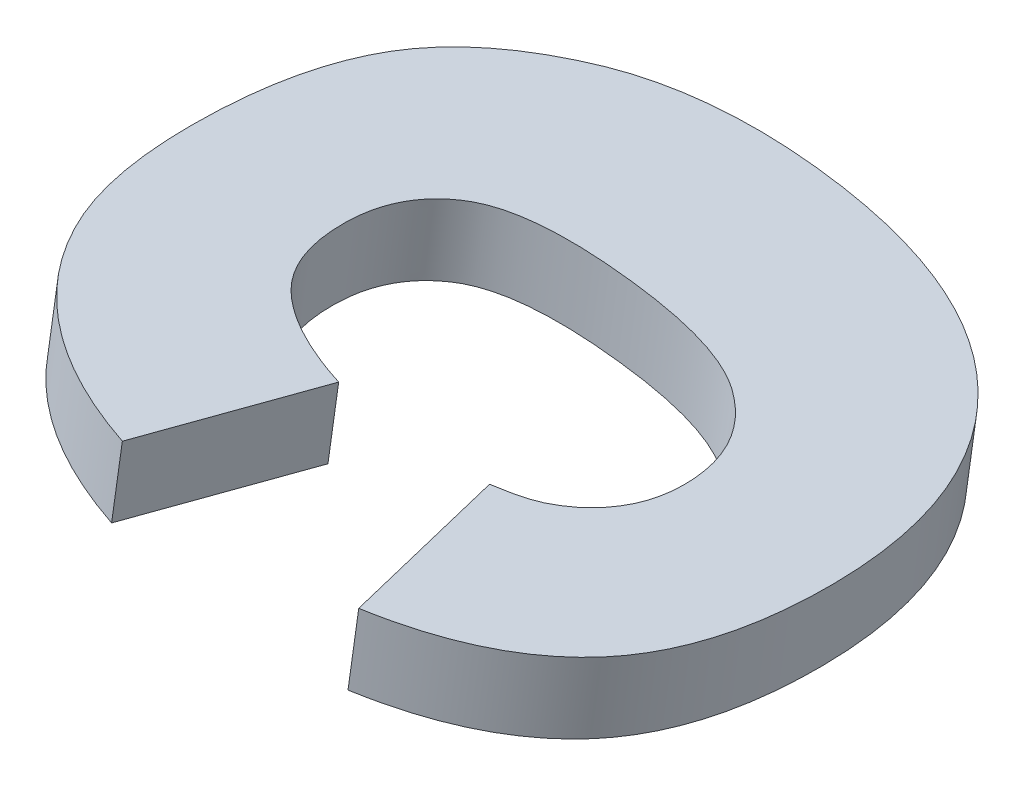
ISO-10303-21;
HEADER;
FILE_DESCRIPTION(('STEP AP214'),'2;1');
FILE_NAME('part.step','',(''),(''),'','','');
FILE_SCHEMA(('AUTOMOTIVE_DESIGN { 1 0 10303 214 1 1 1 1 }'));
ENDSEC;
DATA;
#1=APPLICATION_CONTEXT('core data for automotive mechanical design processes');
#2=APPLICATION_PROTOCOL_DEFINITION('international standard','automotive_design',2000,#1);
#3=PRODUCT_CONTEXT('',#1,'mechanical');
#4=PRODUCT('Part','Part','',(#3));
#5=PRODUCT_RELATED_PRODUCT_CATEGORY('part','',(#4));
#6=PRODUCT_DEFINITION_FORMATION('','',#4);
#7=PRODUCT_DEFINITION_CONTEXT('part definition',#1,'design');
#8=PRODUCT_DEFINITION('design','',#6,#7);
#9=PRODUCT_DEFINITION_SHAPE('','',#8);
#10=(LENGTH_UNIT() NAMED_UNIT(*) SI_UNIT(.MILLI.,.METRE.));
#11=(NAMED_UNIT(*) PLANE_ANGLE_UNIT() SI_UNIT($,.RADIAN.));
#12=(NAMED_UNIT(*) SI_UNIT($,.STERADIAN.) SOLID_ANGLE_UNIT());
#13=UNCERTAINTY_MEASURE_WITH_UNIT(LENGTH_MEASURE(1.E-05),#10,'distance_accuracy_value','');
#14=(GEOMETRIC_REPRESENTATION_CONTEXT(3) GLOBAL_UNCERTAINTY_ASSIGNED_CONTEXT((#13)) GLOBAL_UNIT_ASSIGNED_CONTEXT((#10,
#11,#12)) REPRESENTATION_CONTEXT('',''));
#15=CARTESIAN_POINT('',(0.,0.,0.));
#16=DIRECTION('',(0.,0.,1.));
#17=DIRECTION('',(1.,0.,0.));
#18=AXIS2_PLACEMENT_3D('',#15,#16,#17);
#19=CARTESIAN_POINT('',(837.027965839878,618.973432289034,2834.20564320807));
#20=DIRECTION('',(0.947941965636704,-0.133001987377289,0.289338039563609));
#21=DIRECTION('',(0.286420824998837,-0.0409901500375597,-0.957226680889582));
#22=AXIS2_PLACEMENT_3D('',#19,#20,#21);
#23=PLANE('',#22);
#24=CARTESIAN_POINT('',(835.636235234056,609.070754474657,2834.21326065255));
#25=CARTESIAN_POINT('',(832.395032490339,609.534608270091,2845.04545396276));
#26=CARTESIAN_POINT('',(829.153829746621,609.998462065526,2855.87764727298));
#27=B_SPLINE_CURVE_WITH_KNOTS('',2,(#24,#25,#26),.UNSPECIFIED.,.F.,.F.,(3,3),(0.,1.),.UNSPECIFIED.);
#28=CARTESIAN_POINT('',(835.636235234056,609.070754474657,2834.21326065255));
#29=VERTEX_POINT('',#28);
#30=CARTESIAN_POINT('',(829.153829746621,609.998462065526,2855.87764727298));
#31=VERTEX_POINT('',#30);
#32=EDGE_CURVE('E91',#29,#31,#27,.T.);
#33=ORIENTED_EDGE('',*,*,#32,.F.);
#34=DIRECTION('',(-0.139173060582166,-0.990267781437723,0.000761744447259926));
#35=VECTOR('',#34,1.);
#36=CARTESIAN_POINT('',(837.027965839878,618.973432289034,2834.20564320807));
#37=LINE('',#36,#35);
#38=CARTESIAN_POINT('',(837.027965839878,618.973432289034,2834.20564320807));
#39=VERTEX_POINT('',#38);
#40=EDGE_CURVE('E33',#39,#29,#37,.T.);
#41=ORIENTED_EDGE('',*,*,#40,.F.);
#42=CARTESIAN_POINT('',(837.027965839878,618.973432289034,2834.20564320807));
#43=CARTESIAN_POINT('',(833.78676309616,619.437286084468,2845.03783651829));
#44=CARTESIAN_POINT('',(830.545560352443,619.901139879903,2855.8700298285));
#45=B_SPLINE_CURVE_WITH_KNOTS('',2,(#42,#43,#44),.UNSPECIFIED.,.F.,.F.,(3,3),(0.,1.),.UNSPECIFIED.);
#46=CARTESIAN_POINT('',(830.545560352443,619.901139879903,2855.8700298285));
#47=VERTEX_POINT('',#46);
#48=EDGE_CURVE('E72',#39,#47,#45,.T.);
#49=ORIENTED_EDGE('',*,*,#48,.T.);
#50=DIRECTION('',(-0.139173060582166,-0.990267781437723,0.000761744447259926));
#51=VECTOR('',#50,1.);
#52=CARTESIAN_POINT('',(830.545560352443,619.901139879903,2855.8700298285));
#53=LINE('',#52,#51);
#54=EDGE_CURVE('E11',#47,#31,#53,.T.);
#55=ORIENTED_EDGE('',*,*,#54,.T.);
#56=EDGE_LOOP('',(#33,#41,#49,#55));
#57=FACE_BOUND('',#56,.T.);
#58=ADVANCED_FACE('F17',(#57),#23,.T.);
#59=CARTESIAN_POINT('',(830.545560352443,619.901139879903,2855.8700298285));
#60=CARTESIAN_POINT('',(821.52078501529,621.167810254376,2853.68722009345));
#61=CARTESIAN_POINT('',(815.46789874342,622.014877911899,2848.99417916308));
#62=CARTESIAN_POINT('',(809.41501247155,622.861945569421,2844.3011382327));
#63=CARTESIAN_POINT('',(806.334041298495,623.289595748215,2837.34343220221));
#64=CARTESIAN_POINT('',(803.253070125441,623.717245927008,2830.38572617173));
#65=CARTESIAN_POINT('',(803.251930435162,623.709136609304,2819.63538822657));
#66=CARTESIAN_POINT('',(803.25054776523,623.699298401531,2806.59310005961));
#67=CARTESIAN_POINT('',(807.002861587318,623.165585552701,2798.32570818808));
#68=CARTESIAN_POINT('',(810.755175409408,622.63187270387,2790.05831631656));
#69=CARTESIAN_POINT('',(820.205063726647,621.299160029788,2784.05558954515));
#70=CARTESIAN_POINT('',(829.654952043887,619.966447355707,2778.05286277375));
#71=CARTESIAN_POINT('',(844.398361617809,617.894396267829,2778.05286277375));
#72=CARTESIAN_POINT('',(864.055115233348,615.131819707161,2778.05286277375));
#73=CARTESIAN_POINT('',(874.614140483256,613.655968055736,2788.61220486708));
#74=CARTESIAN_POINT('',(885.173165733164,612.180116404311,2799.17154696042));
#75=CARTESIAN_POINT('',(885.175213704528,612.194688477749,2818.48941311567));
#76=CARTESIAN_POINT('',(885.176816213195,612.206090919393,2833.60537053093));
#77=CARTESIAN_POINT('',(879.125344430021,613.06322318696,2842.25475410609));
#78=CARTESIAN_POINT('',(873.073872646847,613.920355454526,2850.90413768125));
#79=CARTESIAN_POINT('',(860.537227143758,615.685498315391,2855.10604642124));
#80=B_SPLINE_CURVE_WITH_KNOTS('',2,(#59,#60,#61,#62,#63,#64,#65,#66,#67,#68,#69,#70,#71,#72,#73,
#74,#75,#76,#77,#78,#79),.UNSPECIFIED.,.F.,.F.,(3,2,2,2,2,2,2,2,2,2,3),(1.,2.,3.,4.,5.,6.,7.,8.,
9.,10.,11.),.UNSPECIFIED.);
#81=DIRECTION('',(-0.139173060582166,-0.990267781437723,0.000761744447259926));
#82=VECTOR('',#81,1.);
#83=SURFACE_OF_LINEAR_EXTRUSION('',#80,#82);
#84=CARTESIAN_POINT('',(829.153829746621,609.998462065526,2855.87764727298));
#85=CARTESIAN_POINT('',(820.129054409469,611.265132439999,2853.69483753792));
#86=CARTESIAN_POINT('',(814.076168137598,612.112200097522,2849.00179660755));
#87=CARTESIAN_POINT('',(808.023281865728,612.959267755044,2844.30875567718));
#88=CARTESIAN_POINT('',(804.942310692674,613.386917933838,2837.35104964669));
#89=CARTESIAN_POINT('',(801.861339519619,613.814568112631,2830.3933436162));
#90=CARTESIAN_POINT('',(801.86019982934,613.806458794927,2819.64300567105));
#91=CARTESIAN_POINT('',(801.858817159408,613.796620587154,2806.60071750408));
#92=CARTESIAN_POINT('',(805.611130981497,613.262907738323,2798.33332563255));
#93=CARTESIAN_POINT('',(809.363444803586,612.729194889493,2790.06593376103));
#94=CARTESIAN_POINT('',(818.813333120825,611.396482215411,2784.06320698962));
#95=CARTESIAN_POINT('',(828.263221438065,610.06376954133,2778.06048021822));
#96=CARTESIAN_POINT('',(843.006631011988,607.991718453451,2778.06048021822));
#97=CARTESIAN_POINT('',(862.663384627526,605.229141892784,2778.06048021822));
#98=CARTESIAN_POINT('',(873.222409877434,603.753290241359,2788.61982231156));
#99=CARTESIAN_POINT('',(883.781435127342,602.277438589934,2799.17916440489));
#100=CARTESIAN_POINT('',(883.783483098707,602.292010663371,2818.49703056014));
#101=CARTESIAN_POINT('',(883.785085607373,602.303413105016,2833.6129879754));
#102=CARTESIAN_POINT('',(877.733613824199,603.160545372582,2842.26237155056));
#103=CARTESIAN_POINT('',(871.682142041025,604.017677640149,2850.91175512572));
#104=CARTESIAN_POINT('',(859.145496537936,605.782820501013,2855.11366386571));
#105=B_SPLINE_CURVE_WITH_KNOTS('',2,(#84,#85,#86,#87,#88,#89,#90,#91,#92,#93,#94,#95,#96,#97,
#98,#99,#100,#101,#102,#103,#104),.UNSPECIFIED.,.F.,.F.,(3,2,2,2,2,2,2,2,2,2,3),(1.,2.,3.,4.,5.,
6.,7.,8.,9.,10.,11.),.UNSPECIFIED.);
#106=CARTESIAN_POINT('',(859.145496537936,605.782820501013,2855.11366386571));
#107=VERTEX_POINT('',#106);
#108=EDGE_CURVE('E115',#31,#107,#105,.T.);
#109=ORIENTED_EDGE('',*,*,#108,.F.);
#110=ORIENTED_EDGE('',*,*,#54,.F.);
#111=CARTESIAN_POINT('',(860.537227143758,615.685498315391,2855.10604642124));
#112=VERTEX_POINT('',#111);
#113=EDGE_CURVE('E68',#47,#112,#80,.T.);
#114=ORIENTED_EDGE('',*,*,#113,.T.);
#115=DIRECTION('',(-0.139173060582166,-0.990267781437723,0.000761744447259926));
#116=VECTOR('',#115,1.);
#117=CARTESIAN_POINT('',(860.537227143758,615.685498315391,2855.10604642124));
#118=LINE('',#117,#116);
#119=EDGE_CURVE('E25',#112,#107,#118,.T.);
#120=ORIENTED_EDGE('',*,*,#119,.T.);
#121=EDGE_LOOP('',(#109,#110,#114,#120));
#122=FACE_BOUND('',#121,.T.);
#123=ADVANCED_FACE('F69',(#122),#83,.T.);
#124=CARTESIAN_POINT('',(860.537227143758,615.685498315391,2855.10604642124));
#125=DIRECTION('',(-0.966606955237707,0.13601481660631,0.217188774455866));
#126=DIRECTION('',(0.215178654364884,-0.0294905189842774,0.976129323397139));
#127=AXIS2_PLACEMENT_3D('',#124,#125,#126);
#128=PLANE('',#127);
#129=CARTESIAN_POINT('',(859.145496537936,605.782820501013,2855.11366386571));
#130=CARTESIAN_POINT('',(856.739595750686,606.112552383807,2844.19961519042));
#131=CARTESIAN_POINT('',(854.333694963434,606.4422842666,2833.28556651515));
#132=B_SPLINE_CURVE_WITH_KNOTS('',2,(#129,#130,#131),.UNSPECIFIED.,.F.,.F.,(3,3),(11.,12.),.UNSPECIFIED.);
#133=CARTESIAN_POINT('',(854.333694963434,606.4422842666,2833.28556651515));
#134=VERTEX_POINT('',#133);
#135=EDGE_CURVE('E66',#107,#134,#132,.T.);
#136=ORIENTED_EDGE('',*,*,#135,.F.);
#137=ORIENTED_EDGE('',*,*,#119,.F.);
#138=CARTESIAN_POINT('',(860.537227143758,615.685498315391,2855.10604642124));
#139=CARTESIAN_POINT('',(858.131326356507,616.015230198184,2844.19199774596));
#140=CARTESIAN_POINT('',(855.725425569256,616.344962080978,2833.27794907067));
#141=B_SPLINE_CURVE_WITH_KNOTS('',2,(#138,#139,#140),.UNSPECIFIED.,.F.,.F.,(3,3),(11.,12.),.UNSPECIFIED.);
#142=CARTESIAN_POINT('',(855.725425569256,616.344962080978,2833.27794907067));
#143=VERTEX_POINT('',#142);
#144=EDGE_CURVE('E63',#112,#143,#141,.T.);
#145=ORIENTED_EDGE('',*,*,#144,.T.);
#146=DIRECTION('',(-0.139173060582166,-0.990267781437723,0.000761744447259926));
#147=VECTOR('',#146,1.);
#148=CARTESIAN_POINT('',(855.725425569256,616.344962080978,2833.27794907067));
#149=LINE('',#148,#147);
#150=EDGE_CURVE('E49',#143,#134,#149,.T.);
#151=ORIENTED_EDGE('',*,*,#150,.T.);
#152=EDGE_LOOP('',(#136,#137,#145,#151));
#153=FACE_BOUND('',#152,.T.);
#154=ADVANCED_FACE('F61',(#153),#128,.T.);
#155=CARTESIAN_POINT('',(855.725425569256,616.344962080978,2833.27794907067));
#156=CARTESIAN_POINT('',(859.345929487652,615.835251918927,2832.13197395977));
#157=CARTESIAN_POINT('',(861.026604351187,615.598088908026,2830.88454242842));
#158=CARTESIAN_POINT('',(863.830828960013,615.202379799797,2828.8031891138));
#159=CARTESIAN_POINT('',(865.343607957897,614.987463835648,2825.80182572811));
#160=CARTESIAN_POINT('',(866.856386955782,614.772547871499,2822.8004623424));
#161=CARTESIAN_POINT('',(866.855993560153,614.76974871615,2819.0896857928));
#162=CARTESIAN_POINT('',(866.855102634757,614.763409452564,2810.68586831284));
#163=CARTESIAN_POINT('',(860.17804889476,615.69834661917,2806.18586713776));
#164=CARTESIAN_POINT('',(855.19531535533,616.396040985385,2802.82775326664));
#165=CARTESIAN_POINT('',(844.56310566775,617.890300609609,2802.82775326664));
#166=CARTESIAN_POINT('',(831.392743000431,619.741274372208,2802.82775326664));
#167=CARTESIAN_POINT('',(826.50853538296,620.430811293788,2806.86595127649));
#168=CARTESIAN_POINT('',(821.624327765488,621.120348215369,2810.90414928634));
#169=CARTESIAN_POINT('',(821.625102986287,621.12586419797,2818.21656189879));
#170=CARTESIAN_POINT('',(821.625855066167,621.131215524373,2825.31069353772));
#171=CARTESIAN_POINT('',(825.571100303359,620.579538943467,2828.93961472225));
#172=CARTESIAN_POINT('',(829.51634554055,620.027862362561,2832.56853590678));
#173=CARTESIAN_POINT('',(837.027965839878,618.973432289034,2834.20564320807));
#174=B_SPLINE_CURVE_WITH_KNOTS('',2,(#155,#156,#157,#158,#159,#160,#161,#162,#163,#164,#165,
#166,#167,#168,#169,#170,#171,#172,#173),.UNSPECIFIED.,.F.,.F.,(3,2,2,2,2,2,2,2,2,3),(12.,13.,
14.,15.,16.,17.,18.,19.,20.,21.),.UNSPECIFIED.);
#175=DIRECTION('',(-0.139173060582166,-0.990267781437723,0.000761744447259926));
#176=VECTOR('',#175,1.);
#177=SURFACE_OF_LINEAR_EXTRUSION('',#174,#176);
#178=CARTESIAN_POINT('',(854.333694963434,606.4422842666,2833.28556651515));
#179=CARTESIAN_POINT('',(857.95419888183,605.93257410455,2832.13959140424));
#180=CARTESIAN_POINT('',(859.634873745366,605.695411093648,2830.8921598729));
#181=CARTESIAN_POINT('',(862.439098354191,605.29970198542,2828.81080655828));
#182=CARTESIAN_POINT('',(863.951877352075,605.084786021271,2825.80944317258));
#183=CARTESIAN_POINT('',(865.46465634996,604.869870057122,2822.80807978687));
#184=CARTESIAN_POINT('',(865.464262954331,604.867070901773,2819.09730323728));
#185=CARTESIAN_POINT('',(865.463372028935,604.860731638187,2810.69348575732));
#186=CARTESIAN_POINT('',(858.786318288939,605.795668804793,2806.19348458224));
#187=CARTESIAN_POINT('',(853.803584749508,606.493363171008,2802.83537071111));
#188=CARTESIAN_POINT('',(843.171375061928,607.987622795232,2802.83537071111));
#189=CARTESIAN_POINT('',(830.00101239461,609.83859655783,2802.83537071111));
#190=CARTESIAN_POINT('',(825.116804777138,610.528133479411,2806.87356872097));
#191=CARTESIAN_POINT('',(820.232597159667,611.217670400992,2810.91176673082));
#192=CARTESIAN_POINT('',(820.233372380466,611.223186383593,2818.22417934326));
#193=CARTESIAN_POINT('',(820.234124460345,611.228537709996,2825.31831098219));
#194=CARTESIAN_POINT('',(824.179369697537,610.67686112909,2828.94723216672));
#195=CARTESIAN_POINT('',(828.124614934728,610.125184548183,2832.57615335125));
#196=CARTESIAN_POINT('',(835.636235234056,609.070754474657,2834.21326065255));
#197=B_SPLINE_CURVE_WITH_KNOTS('',2,(#178,#179,#180,#181,#182,#183,#184,#185,#186,#187,#188,
#189,#190,#191,#192,#193,#194,#195,#196),.UNSPECIFIED.,.F.,.F.,(3,2,2,2,2,2,2,2,2,3),(12.,13.,
14.,15.,16.,17.,18.,19.,20.,21.),.UNSPECIFIED.);
#198=EDGE_CURVE('E116',#134,#29,#197,.T.);
#199=ORIENTED_EDGE('',*,*,#198,.F.);
#200=ORIENTED_EDGE('',*,*,#150,.F.);
#201=EDGE_CURVE('E75',#143,#39,#174,.T.);
#202=ORIENTED_EDGE('',*,*,#201,.T.);
#203=ORIENTED_EDGE('',*,*,#40,.T.);
#204=EDGE_LOOP('',(#199,#200,#202,#203));
#205=FACE_BOUND('',#204,.T.);
#206=ADVANCED_FACE('F99',(#205),#177,.T.);
#207=CARTESIAN_POINT('',(820.205063726647,621.299160029788,2784.05558954515));
#208=DIRECTION('',(0.139173060582148,0.990267781437725,-0.000761744447236867));
#209=DIRECTION('',(0.28642082499884,-0.0409901500375328,-0.957226680889582));
#210=AXIS2_PLACEMENT_3D('',#207,#208,#209);
#211=PLANE('',#210);
#212=ORIENTED_EDGE('',*,*,#48,.F.);
#213=ORIENTED_EDGE('',*,*,#201,.F.);
#214=ORIENTED_EDGE('',*,*,#144,.F.);
#215=ORIENTED_EDGE('',*,*,#113,.F.);
#216=EDGE_LOOP('',(#212,#213,#214,#215));
#217=FACE_BOUND('',#216,.T.);
#218=ADVANCED_FACE('F74',(#217),#211,.T.);
#219=CARTESIAN_POINT('',(818.813333120825,611.396482215411,2784.06320698962));
#220=DIRECTION('',(0.139173060582148,0.990267781437725,-0.000761744447236867));
#221=DIRECTION('',(0.28642082499884,-0.0409901500375328,-0.957226680889582));
#222=AXIS2_PLACEMENT_3D('',#219,#220,#221);
#223=PLANE('',#222);
#224=ORIENTED_EDGE('',*,*,#32,.T.);
#225=ORIENTED_EDGE('',*,*,#108,.T.);
#226=ORIENTED_EDGE('',*,*,#135,.T.);
#227=ORIENTED_EDGE('',*,*,#198,.T.);
#228=EDGE_LOOP('',(#224,#225,#226,#227));
#229=FACE_BOUND('',#228,.T.);
#230=ADVANCED_FACE('F103',(#229),#223,.F.);
#231=CLOSED_SHELL('',(#58,#123,#154,#206,#218,#230));
#232=MANIFOLD_SOLID_BREP('B1',#231);
#233=ADVANCED_BREP_SHAPE_REPRESENTATION('',(#18,#232),#14);
#234=SHAPE_DEFINITION_REPRESENTATION(#9,#233);
ENDSEC;
END-ISO-10303-21;
